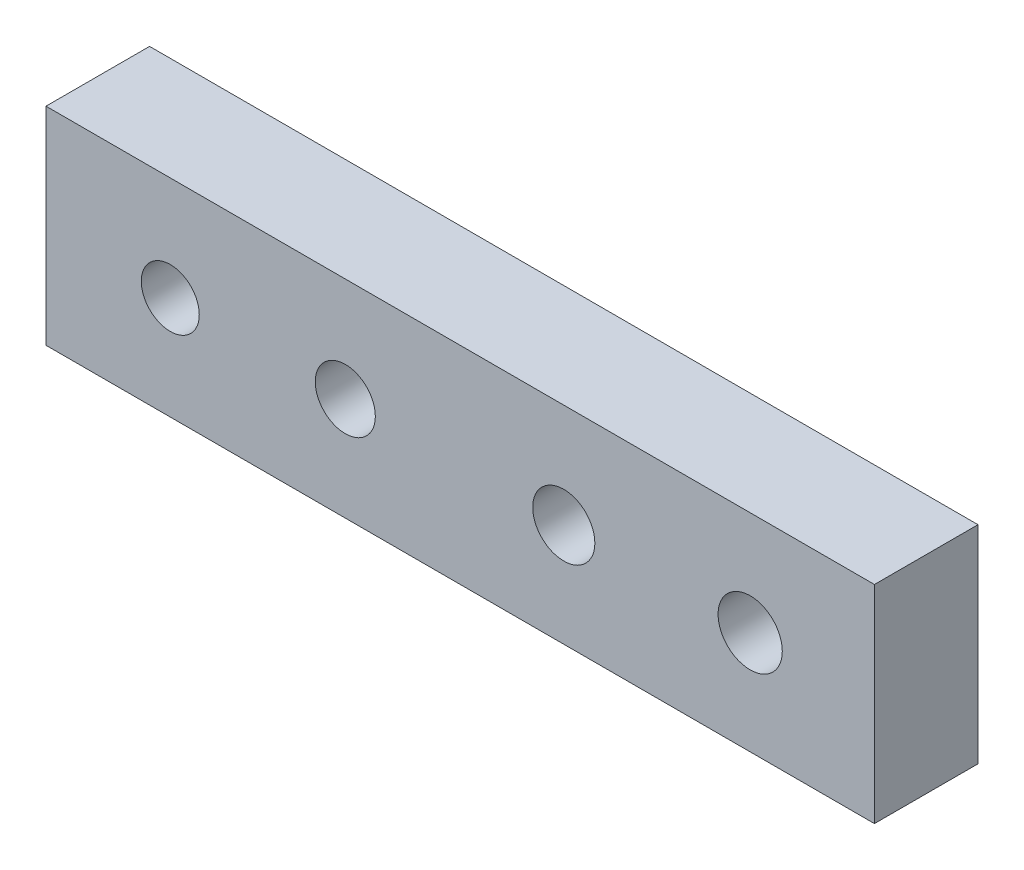
ISO-10303-21;
HEADER;
FILE_DESCRIPTION(('STEP AP214'),'2;1');
FILE_NAME('part.step','',(''),(''),'','','');
FILE_SCHEMA(('AUTOMOTIVE_DESIGN { 1 0 10303 214 1 1 1 1 }'));
ENDSEC;
DATA;
#1=APPLICATION_CONTEXT('core data for automotive mechanical design processes');
#2=APPLICATION_PROTOCOL_DEFINITION('international standard','automotive_design',2000,#1);
#3=PRODUCT_CONTEXT('',#1,'mechanical');
#4=PRODUCT('Part','Part','',(#3));
#5=PRODUCT_RELATED_PRODUCT_CATEGORY('part','',(#4));
#6=PRODUCT_DEFINITION_FORMATION('','',#4);
#7=PRODUCT_DEFINITION_CONTEXT('part definition',#1,'design');
#8=PRODUCT_DEFINITION('design','',#6,#7);
#9=PRODUCT_DEFINITION_SHAPE('','',#8);
#10=(LENGTH_UNIT() NAMED_UNIT(*) SI_UNIT(.MILLI.,.METRE.));
#11=(NAMED_UNIT(*) PLANE_ANGLE_UNIT() SI_UNIT($,.RADIAN.));
#12=(NAMED_UNIT(*) SI_UNIT($,.STERADIAN.) SOLID_ANGLE_UNIT());
#13=UNCERTAINTY_MEASURE_WITH_UNIT(LENGTH_MEASURE(1.E-05),#10,'distance_accuracy_value','');
#14=(GEOMETRIC_REPRESENTATION_CONTEXT(3) GLOBAL_UNCERTAINTY_ASSIGNED_CONTEXT((#13)) GLOBAL_UNIT_ASSIGNED_CONTEXT((#10,
#11,#12)) REPRESENTATION_CONTEXT('',''));
#15=CARTESIAN_POINT('',(0.,0.,0.));
#16=DIRECTION('',(0.,0.,1.));
#17=DIRECTION('',(1.,0.,0.));
#18=AXIS2_PLACEMENT_3D('',#15,#16,#17);
#19=CARTESIAN_POINT('',(0.,0.,5.));
#20=DIRECTION('',(1.,0.,0.));
#21=DIRECTION('',(0.,1.,0.));
#22=AXIS2_PLACEMENT_3D('',#19,#20,#21);
#23=PLANE('',#22);
#24=DIRECTION('',(0.,-1.,0.));
#25=VECTOR('',#24,1.);
#26=CARTESIAN_POINT('',(0.,0.,0.));
#27=LINE('',#26,#25);
#28=CARTESIAN_POINT('',(0.,0.,0.));
#29=VERTEX_POINT('',#28);
#30=CARTESIAN_POINT('',(0.,-10.,0.));
#31=VERTEX_POINT('',#30);
#32=EDGE_CURVE('E105',#29,#31,#27,.T.);
#33=ORIENTED_EDGE('',*,*,#32,.T.);
#34=DIRECTION('',(0.,0.,-1.));
#35=VECTOR('',#34,1.);
#36=CARTESIAN_POINT('',(0.,-10.,5.));
#37=LINE('',#36,#35);
#38=CARTESIAN_POINT('',(0.,-10.,5.));
#39=VERTEX_POINT('',#38);
#40=EDGE_CURVE('E11',#39,#31,#37,.T.);
#41=ORIENTED_EDGE('',*,*,#40,.F.);
#42=DIRECTION('',(0.,-1.,0.));
#43=VECTOR('',#42,1.);
#44=CARTESIAN_POINT('',(0.,0.,5.));
#45=LINE('',#44,#43);
#46=CARTESIAN_POINT('',(0.,0.,5.));
#47=VERTEX_POINT('',#46);
#48=EDGE_CURVE('E89',#47,#39,#45,.T.);
#49=ORIENTED_EDGE('',*,*,#48,.F.);
#50=DIRECTION('',(0.,0.,-1.));
#51=VECTOR('',#50,1.);
#52=CARTESIAN_POINT('',(0.,0.,5.));
#53=LINE('',#52,#51);
#54=EDGE_CURVE('E97',#47,#29,#53,.T.);
#55=ORIENTED_EDGE('',*,*,#54,.T.);
#56=EDGE_LOOP('',(#33,#41,#49,#55));
#57=FACE_BOUND('',#56,.T.);
#58=ADVANCED_FACE('F39',(#57),#23,.F.);
#59=CARTESIAN_POINT('',(0.,-10.,5.));
#60=DIRECTION('',(0.,1.,0.));
#61=DIRECTION('',(0.,0.,1.));
#62=AXIS2_PLACEMENT_3D('',#59,#60,#61);
#63=PLANE('',#62);
#64=DIRECTION('',(1.,0.,0.));
#65=VECTOR('',#64,1.);
#66=CARTESIAN_POINT('',(0.,-10.,0.));
#67=LINE('',#66,#65);
#68=CARTESIAN_POINT('',(40.,-10.,0.));
#69=VERTEX_POINT('',#68);
#70=EDGE_CURVE('E92',#31,#69,#67,.T.);
#71=ORIENTED_EDGE('',*,*,#70,.T.);
#72=DIRECTION('',(0.,0.,-1.));
#73=VECTOR('',#72,1.);
#74=CARTESIAN_POINT('',(40.,-10.,5.));
#75=LINE('',#74,#73);
#76=CARTESIAN_POINT('',(40.,-10.,5.));
#77=VERTEX_POINT('',#76);
#78=EDGE_CURVE('E50',#77,#69,#75,.T.);
#79=ORIENTED_EDGE('',*,*,#78,.F.);
#80=DIRECTION('',(1.,0.,0.));
#81=VECTOR('',#80,1.);
#82=CARTESIAN_POINT('',(0.,-10.,5.));
#83=LINE('',#82,#81);
#84=EDGE_CURVE('E82',#39,#77,#83,.T.);
#85=ORIENTED_EDGE('',*,*,#84,.F.);
#86=ORIENTED_EDGE('',*,*,#40,.T.);
#87=EDGE_LOOP('',(#71,#79,#85,#86));
#88=FACE_BOUND('',#87,.T.);
#89=ADVANCED_FACE('F93',(#88),#63,.F.);
#90=CARTESIAN_POINT('',(40.,0.,5.));
#91=DIRECTION('',(-1.,0.,0.));
#92=DIRECTION('',(0.,0.,1.));
#93=AXIS2_PLACEMENT_3D('',#90,#91,#92);
#94=PLANE('',#93);
#95=DIRECTION('',(0.,1.,0.));
#96=VECTOR('',#95,1.);
#97=CARTESIAN_POINT('',(40.,0.,0.));
#98=LINE('',#97,#96);
#99=CARTESIAN_POINT('',(40.,0.,0.));
#100=VERTEX_POINT('',#99);
#101=EDGE_CURVE('E75',#69,#100,#98,.T.);
#102=ORIENTED_EDGE('',*,*,#101,.T.);
#103=DIRECTION('',(0.,0.,-1.));
#104=VECTOR('',#103,1.);
#105=CARTESIAN_POINT('',(40.,0.,5.));
#106=LINE('',#105,#104);
#107=CARTESIAN_POINT('',(40.,0.,5.));
#108=VERTEX_POINT('',#107);
#109=EDGE_CURVE('E94',#108,#100,#106,.T.);
#110=ORIENTED_EDGE('',*,*,#109,.F.);
#111=DIRECTION('',(0.,1.,0.));
#112=VECTOR('',#111,1.);
#113=CARTESIAN_POINT('',(40.,0.,5.));
#114=LINE('',#113,#112);
#115=EDGE_CURVE('E88',#77,#108,#114,.T.);
#116=ORIENTED_EDGE('',*,*,#115,.F.);
#117=ORIENTED_EDGE('',*,*,#78,.T.);
#118=EDGE_LOOP('',(#102,#110,#116,#117));
#119=FACE_BOUND('',#118,.T.);
#120=ADVANCED_FACE('F96',(#119),#94,.F.);
#121=CARTESIAN_POINT('',(0.,0.,5.));
#122=DIRECTION('',(0.,-1.,0.));
#123=DIRECTION('',(0.,0.,-1.));
#124=AXIS2_PLACEMENT_3D('',#121,#122,#123);
#125=PLANE('',#124);
#126=DIRECTION('',(-1.,0.,0.));
#127=VECTOR('',#126,1.);
#128=CARTESIAN_POINT('',(0.,0.,0.));
#129=LINE('',#128,#127);
#130=EDGE_CURVE('E76',#100,#29,#129,.T.);
#131=ORIENTED_EDGE('',*,*,#130,.T.);
#132=ORIENTED_EDGE('',*,*,#54,.F.);
#133=DIRECTION('',(-1.,0.,0.));
#134=VECTOR('',#133,1.);
#135=CARTESIAN_POINT('',(0.,0.,5.));
#136=LINE('',#135,#134);
#137=EDGE_CURVE('E54',#108,#47,#136,.T.);
#138=ORIENTED_EDGE('',*,*,#137,.F.);
#139=ORIENTED_EDGE('',*,*,#109,.T.);
#140=EDGE_LOOP('',(#131,#132,#138,#139));
#141=FACE_BOUND('',#140,.T.);
#142=ADVANCED_FACE('F106',(#141),#125,.F.);
#143=CARTESIAN_POINT('',(0.,0.,5.));
#144=DIRECTION('',(0.,0.,1.));
#145=DIRECTION('',(1.,0.,0.));
#146=AXIS2_PLACEMENT_3D('',#143,#144,#145);
#147=PLANE('',#146);
#148=CARTESIAN_POINT('',(6.,-5.02031949226667,5.));
#149=DIRECTION('',(0.,0.,1.));
#150=DIRECTION('',(1.,0.,0.));
#151=AXIS2_PLACEMENT_3D('',#148,#149,#150);
#152=CIRCLE('',#151,1.4);
#153=CARTESIAN_POINT('',(7.4,-5.02031949226667,5.));
#154=VERTEX_POINT('',#153);
#155=EDGE_CURVE('E132',#154,#154,#152,.T.);
#156=ORIENTED_EDGE('',*,*,#155,.F.);
#157=EDGE_LOOP('',(#156));
#158=FACE_BOUND('',#157,.T.);
#159=CARTESIAN_POINT('',(14.4512435370521,-5.02031949226667,5.));
#160=DIRECTION('',(0.,0.,1.));
#161=DIRECTION('',(1.,0.,0.));
#162=AXIS2_PLACEMENT_3D('',#159,#160,#161);
#163=CIRCLE('',#162,1.45);
#164=CARTESIAN_POINT('',(15.9012435370521,-5.02031949226667,5.));
#165=VERTEX_POINT('',#164);
#166=EDGE_CURVE('E131',#165,#165,#163,.T.);
#167=ORIENTED_EDGE('',*,*,#166,.F.);
#168=EDGE_LOOP('',(#167));
#169=FACE_BOUND('',#168,.T.);
#170=CARTESIAN_POINT('',(25.,-5.02031949226667,5.));
#171=DIRECTION('',(0.,0.,1.));
#172=DIRECTION('',(1.,0.,0.));
#173=AXIS2_PLACEMENT_3D('',#170,#171,#172);
#174=CIRCLE('',#173,1.5);
#175=CARTESIAN_POINT('',(26.5,-5.02031949226667,5.));
#176=VERTEX_POINT('',#175);
#177=EDGE_CURVE('E124',#176,#176,#174,.T.);
#178=ORIENTED_EDGE('',*,*,#177,.F.);
#179=EDGE_LOOP('',(#178));
#180=FACE_BOUND('',#179,.T.);
#181=CARTESIAN_POINT('',(34.,-5.02031949226667,5.));
#182=DIRECTION('',(0.,0.,1.));
#183=DIRECTION('',(1.,0.,0.));
#184=AXIS2_PLACEMENT_3D('',#181,#182,#183);
#185=CIRCLE('',#184,1.55);
#186=CARTESIAN_POINT('',(35.55,-5.02031949226667,5.));
#187=VERTEX_POINT('',#186);
#188=EDGE_CURVE('E119',#187,#187,#185,.T.);
#189=ORIENTED_EDGE('',*,*,#188,.F.);
#190=EDGE_LOOP('',(#189));
#191=FACE_BOUND('',#190,.T.);
#192=ORIENTED_EDGE('',*,*,#48,.T.);
#193=ORIENTED_EDGE('',*,*,#84,.T.);
#194=ORIENTED_EDGE('',*,*,#115,.T.);
#195=ORIENTED_EDGE('',*,*,#137,.T.);
#196=EDGE_LOOP('',(#192,#193,#194,#195));
#197=FACE_BOUND('',#196,.T.);
#198=ADVANCED_FACE('F86',(#158,#169,#180,#191,#197),#147,.T.);
#199=CARTESIAN_POINT('',(0.,0.,0.));
#200=DIRECTION('',(0.,0.,1.));
#201=DIRECTION('',(1.,0.,0.));
#202=AXIS2_PLACEMENT_3D('',#199,#200,#201);
#203=PLANE('',#202);
#204=CARTESIAN_POINT('',(6.,-5.02031949226667,0.));
#205=DIRECTION('',(0.,0.,1.));
#206=DIRECTION('',(1.,0.,0.));
#207=AXIS2_PLACEMENT_3D('',#204,#205,#206);
#208=CIRCLE('',#207,1.4);
#209=CARTESIAN_POINT('',(7.4,-5.02031949226667,0.));
#210=VERTEX_POINT('',#209);
#211=EDGE_CURVE('E103',#210,#210,#208,.T.);
#212=ORIENTED_EDGE('',*,*,#211,.T.);
#213=EDGE_LOOP('',(#212));
#214=FACE_BOUND('',#213,.T.);
#215=CARTESIAN_POINT('',(14.4512435370521,-5.02031949226667,0.));
#216=DIRECTION('',(0.,0.,1.));
#217=DIRECTION('',(1.,0.,0.));
#218=AXIS2_PLACEMENT_3D('',#215,#216,#217);
#219=CIRCLE('',#218,1.45);
#220=CARTESIAN_POINT('',(15.9012435370521,-5.02031949226667,0.));
#221=VERTEX_POINT('',#220);
#222=EDGE_CURVE('E126',#221,#221,#219,.T.);
#223=ORIENTED_EDGE('',*,*,#222,.T.);
#224=EDGE_LOOP('',(#223));
#225=FACE_BOUND('',#224,.T.);
#226=CARTESIAN_POINT('',(25.,-5.02031949226667,0.));
#227=DIRECTION('',(0.,0.,1.));
#228=DIRECTION('',(1.,0.,0.));
#229=AXIS2_PLACEMENT_3D('',#226,#227,#228);
#230=CIRCLE('',#229,1.5);
#231=CARTESIAN_POINT('',(26.5,-5.02031949226667,0.));
#232=VERTEX_POINT('',#231);
#233=EDGE_CURVE('E122',#232,#232,#230,.T.);
#234=ORIENTED_EDGE('',*,*,#233,.T.);
#235=EDGE_LOOP('',(#234));
#236=FACE_BOUND('',#235,.T.);
#237=CARTESIAN_POINT('',(34.,-5.02031949226667,0.));
#238=DIRECTION('',(0.,0.,1.));
#239=DIRECTION('',(1.,0.,0.));
#240=AXIS2_PLACEMENT_3D('',#237,#238,#239);
#241=CIRCLE('',#240,1.55);
#242=CARTESIAN_POINT('',(35.55,-5.02031949226667,0.));
#243=VERTEX_POINT('',#242);
#244=EDGE_CURVE('E117',#243,#243,#241,.T.);
#245=ORIENTED_EDGE('',*,*,#244,.T.);
#246=EDGE_LOOP('',(#245));
#247=FACE_BOUND('',#246,.T.);
#248=ORIENTED_EDGE('',*,*,#32,.F.);
#249=ORIENTED_EDGE('',*,*,#130,.F.);
#250=ORIENTED_EDGE('',*,*,#101,.F.);
#251=ORIENTED_EDGE('',*,*,#70,.F.);
#252=EDGE_LOOP('',(#248,#249,#250,#251));
#253=FACE_BOUND('',#252,.T.);
#254=ADVANCED_FACE('F111',(#214,#225,#236,#247,#253),#203,.F.);
#255=CARTESIAN_POINT('',(34.,-5.02031949226667,0.));
#256=DIRECTION('',(0.,0.,1.));
#257=DIRECTION('',(1.,0.,0.));
#258=AXIS2_PLACEMENT_3D('',#255,#256,#257);
#259=CYLINDRICAL_SURFACE('',#258,1.55);
#260=ORIENTED_EDGE('',*,*,#244,.F.);
#261=EDGE_LOOP('',(#260));
#262=FACE_BOUND('',#261,.T.);
#263=ORIENTED_EDGE('',*,*,#188,.T.);
#264=EDGE_LOOP('',(#263));
#265=FACE_BOUND('',#264,.T.);
#266=ADVANCED_FACE('F156',(#262,#265),#259,.F.);
#267=CARTESIAN_POINT('',(25.,-5.02031949226667,0.));
#268=DIRECTION('',(0.,0.,1.));
#269=DIRECTION('',(1.,0.,0.));
#270=AXIS2_PLACEMENT_3D('',#267,#268,#269);
#271=CYLINDRICAL_SURFACE('',#270,1.5);
#272=ORIENTED_EDGE('',*,*,#233,.F.);
#273=EDGE_LOOP('',(#272));
#274=FACE_BOUND('',#273,.T.);
#275=ORIENTED_EDGE('',*,*,#177,.T.);
#276=EDGE_LOOP('',(#275));
#277=FACE_BOUND('',#276,.T.);
#278=ADVANCED_FACE('F158',(#274,#277),#271,.F.);
#279=CARTESIAN_POINT('',(14.4512435370521,-5.02031949226667,0.));
#280=DIRECTION('',(0.,0.,1.));
#281=DIRECTION('',(1.,0.,0.));
#282=AXIS2_PLACEMENT_3D('',#279,#280,#281);
#283=CYLINDRICAL_SURFACE('',#282,1.45);
#284=ORIENTED_EDGE('',*,*,#222,.F.);
#285=EDGE_LOOP('',(#284));
#286=FACE_BOUND('',#285,.T.);
#287=ORIENTED_EDGE('',*,*,#166,.T.);
#288=EDGE_LOOP('',(#287));
#289=FACE_BOUND('',#288,.T.);
#290=ADVANCED_FACE('F144',(#286,#289),#283,.F.);
#291=CARTESIAN_POINT('',(6.,-5.02031949226667,0.));
#292=DIRECTION('',(0.,0.,1.));
#293=DIRECTION('',(1.,0.,0.));
#294=AXIS2_PLACEMENT_3D('',#291,#292,#293);
#295=CYLINDRICAL_SURFACE('',#294,1.4);
#296=ORIENTED_EDGE('',*,*,#211,.F.);
#297=EDGE_LOOP('',(#296));
#298=FACE_BOUND('',#297,.T.);
#299=ORIENTED_EDGE('',*,*,#155,.T.);
#300=EDGE_LOOP('',(#299));
#301=FACE_BOUND('',#300,.T.);
#302=ADVANCED_FACE('F145',(#298,#301),#295,.F.);
#303=CLOSED_SHELL('',(#58,#89,#120,#142,#198,#254,#266,#278,#290,#302));
#304=MANIFOLD_SOLID_BREP('B2',#303);
#305=ADVANCED_BREP_SHAPE_REPRESENTATION('',(#18,#304),#14);
#306=SHAPE_DEFINITION_REPRESENTATION(#9,#305);
ENDSEC;
END-ISO-10303-21;
